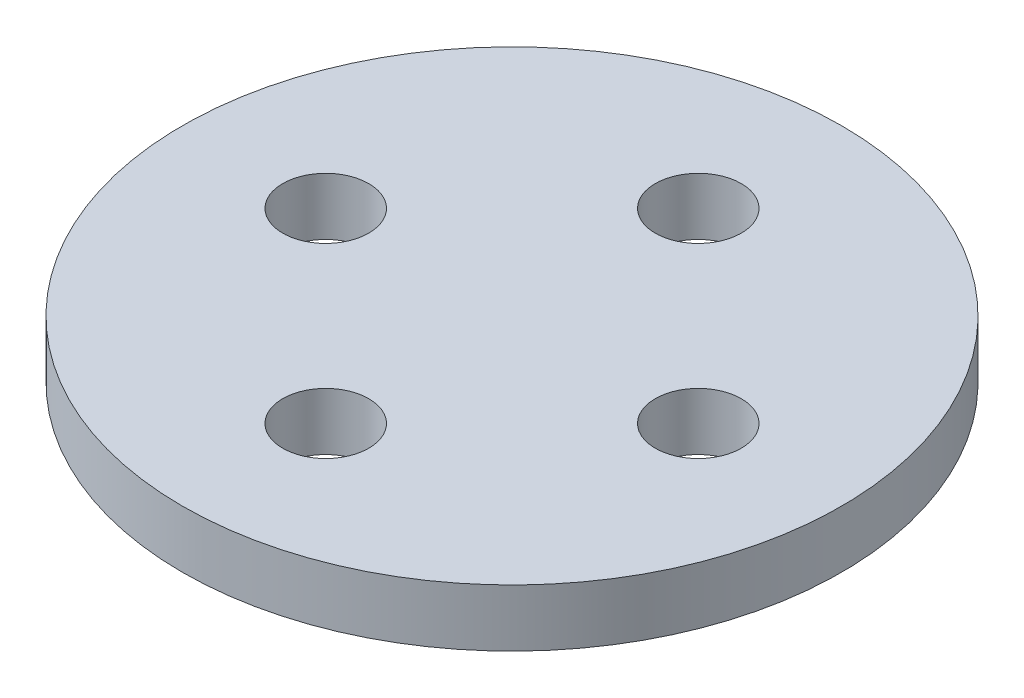
ISO-10303-21;
HEADER;
FILE_DESCRIPTION(('STEP AP214'),'2;1');
FILE_NAME('part.step','',(''),(''),'','','');
FILE_SCHEMA(('AUTOMOTIVE_DESIGN { 1 0 10303 214 1 1 1 1 }'));
ENDSEC;
DATA;
#1=APPLICATION_CONTEXT('core data for automotive mechanical design processes');
#2=APPLICATION_PROTOCOL_DEFINITION('international standard','automotive_design',2000,#1);
#3=PRODUCT_CONTEXT('',#1,'mechanical');
#4=PRODUCT('Part','Part','',(#3));
#5=PRODUCT_RELATED_PRODUCT_CATEGORY('part','',(#4));
#6=PRODUCT_DEFINITION_FORMATION('','',#4);
#7=PRODUCT_DEFINITION_CONTEXT('part definition',#1,'design');
#8=PRODUCT_DEFINITION('design','',#6,#7);
#9=PRODUCT_DEFINITION_SHAPE('','',#8);
#10=(LENGTH_UNIT() NAMED_UNIT(*) SI_UNIT(.MILLI.,.METRE.));
#11=(NAMED_UNIT(*) PLANE_ANGLE_UNIT() SI_UNIT($,.RADIAN.));
#12=(NAMED_UNIT(*) SI_UNIT($,.STERADIAN.) SOLID_ANGLE_UNIT());
#13=UNCERTAINTY_MEASURE_WITH_UNIT(LENGTH_MEASURE(1.E-05),#10,'distance_accuracy_value','');
#14=(GEOMETRIC_REPRESENTATION_CONTEXT(3) GLOBAL_UNCERTAINTY_ASSIGNED_CONTEXT((#13)) GLOBAL_UNIT_ASSIGNED_CONTEXT((#10,
#11,#12)) REPRESENTATION_CONTEXT('',''));
#15=CARTESIAN_POINT('',(0.,0.,0.));
#16=DIRECTION('',(0.,0.,1.));
#17=DIRECTION('',(1.,0.,0.));
#18=AXIS2_PLACEMENT_3D('',#15,#16,#17);
#19=CARTESIAN_POINT('',(0.,2.,0.));
#20=DIRECTION('',(0.,-1.,0.));
#21=DIRECTION('',(0.,0.,-1.));
#22=AXIS2_PLACEMENT_3D('',#19,#20,#21);
#23=CYLINDRICAL_SURFACE('',#22,11.5);
#24=CARTESIAN_POINT('',(0.,2.,0.));
#25=DIRECTION('',(0.,1.,0.));
#26=DIRECTION('',(0.,0.,1.));
#27=AXIS2_PLACEMENT_3D('',#24,#25,#26);
#28=CIRCLE('',#27,11.5);
#29=CARTESIAN_POINT('',(0.,2.,11.5));
#30=VERTEX_POINT('',#29);
#31=EDGE_CURVE('E10',#30,#30,#28,.T.);
#32=ORIENTED_EDGE('',*,*,#31,.F.);
#33=EDGE_LOOP('',(#32));
#34=FACE_BOUND('',#33,.T.);
#35=CARTESIAN_POINT('',(0.,0.,0.));
#36=DIRECTION('',(0.,1.,0.));
#37=DIRECTION('',(0.,0.,1.));
#38=AXIS2_PLACEMENT_3D('',#35,#36,#37);
#39=CIRCLE('',#38,11.5);
#40=CARTESIAN_POINT('',(0.,0.,11.5));
#41=VERTEX_POINT('',#40);
#42=EDGE_CURVE('E42',#41,#41,#39,.T.);
#43=ORIENTED_EDGE('',*,*,#42,.T.);
#44=EDGE_LOOP('',(#43));
#45=FACE_BOUND('',#44,.T.);
#46=ADVANCED_FACE('F39',(#34,#45),#23,.T.);
#47=CARTESIAN_POINT('',(0.,2.,0.));
#48=DIRECTION('',(0.,1.,0.));
#49=DIRECTION('',(0.,0.,1.));
#50=AXIS2_PLACEMENT_3D('',#47,#48,#49);
#51=PLANE('',#50);
#52=CARTESIAN_POINT('',(6.49999999999999,2.,0.));
#53=DIRECTION('',(0.,-1.,0.));
#54=DIRECTION('',(0.,0.,-1.));
#55=AXIS2_PLACEMENT_3D('',#52,#53,#54);
#56=CIRCLE('',#55,1.5);
#57=CARTESIAN_POINT('',(6.49999999999999,2.,-1.5));
#58=VERTEX_POINT('',#57);
#59=EDGE_CURVE('E52',#58,#58,#56,.T.);
#60=ORIENTED_EDGE('',*,*,#59,.T.);
#61=EDGE_LOOP('',(#60));
#62=FACE_BOUND('',#61,.T.);
#63=CARTESIAN_POINT('',(0.,2.,-6.5));
#64=DIRECTION('',(0.,-1.,0.));
#65=DIRECTION('',(0.,0.,-1.));
#66=AXIS2_PLACEMENT_3D('',#63,#64,#65);
#67=CIRCLE('',#66,1.5);
#68=CARTESIAN_POINT('',(0.,2.,-8.00000000000001));
#69=VERTEX_POINT('',#68);
#70=EDGE_CURVE('E66',#69,#69,#67,.T.);
#71=ORIENTED_EDGE('',*,*,#70,.T.);
#72=EDGE_LOOP('',(#71));
#73=FACE_BOUND('',#72,.T.);
#74=CARTESIAN_POINT('',(-6.50000000000001,2.,0.));
#75=DIRECTION('',(0.,-1.,0.));
#76=DIRECTION('',(0.,0.,-1.));
#77=AXIS2_PLACEMENT_3D('',#74,#75,#76);
#78=CIRCLE('',#77,1.50000000000001);
#79=CARTESIAN_POINT('',(-6.50000000000001,2.,-1.50000000000001));
#80=VERTEX_POINT('',#79);
#81=EDGE_CURVE('E60',#80,#80,#78,.T.);
#82=ORIENTED_EDGE('',*,*,#81,.T.);
#83=EDGE_LOOP('',(#82));
#84=FACE_BOUND('',#83,.T.);
#85=CARTESIAN_POINT('',(0.,2.,6.5));
#86=DIRECTION('',(0.,-1.,0.));
#87=DIRECTION('',(0.,0.,-1.));
#88=AXIS2_PLACEMENT_3D('',#85,#86,#87);
#89=CIRCLE('',#88,1.50000000000001);
#90=CARTESIAN_POINT('',(0.,2.,5.));
#91=VERTEX_POINT('',#90);
#92=EDGE_CURVE('E54',#91,#91,#89,.T.);
#93=ORIENTED_EDGE('',*,*,#92,.T.);
#94=EDGE_LOOP('',(#93));
#95=FACE_BOUND('',#94,.T.);
#96=ORIENTED_EDGE('',*,*,#31,.T.);
#97=EDGE_LOOP('',(#96));
#98=FACE_BOUND('',#97,.T.);
#99=ADVANCED_FACE('F80',(#62,#73,#84,#95,#98),#51,.T.);
#100=CARTESIAN_POINT('',(0.,0.,0.));
#101=DIRECTION('',(0.,1.,0.));
#102=DIRECTION('',(0.,0.,1.));
#103=AXIS2_PLACEMENT_3D('',#100,#101,#102);
#104=PLANE('',#103);
#105=CARTESIAN_POINT('',(6.49999999999999,0.,0.));
#106=DIRECTION('',(0.,-1.,0.));
#107=DIRECTION('',(0.,0.,-1.));
#108=AXIS2_PLACEMENT_3D('',#105,#106,#107);
#109=CIRCLE('',#108,1.5);
#110=CARTESIAN_POINT('',(6.49999999999999,0.,-1.5));
#111=VERTEX_POINT('',#110);
#112=EDGE_CURVE('E73',#111,#111,#109,.T.);
#113=ORIENTED_EDGE('',*,*,#112,.F.);
#114=EDGE_LOOP('',(#113));
#115=FACE_BOUND('',#114,.T.);
#116=CARTESIAN_POINT('',(0.,0.,-6.5));
#117=DIRECTION('',(0.,-1.,0.));
#118=DIRECTION('',(0.,0.,-1.));
#119=AXIS2_PLACEMENT_3D('',#116,#117,#118);
#120=CIRCLE('',#119,1.5);
#121=CARTESIAN_POINT('',(0.,0.,-8.00000000000001));
#122=VERTEX_POINT('',#121);
#123=EDGE_CURVE('E70',#122,#122,#120,.T.);
#124=ORIENTED_EDGE('',*,*,#123,.F.);
#125=EDGE_LOOP('',(#124));
#126=FACE_BOUND('',#125,.T.);
#127=CARTESIAN_POINT('',(-6.50000000000001,0.,0.));
#128=DIRECTION('',(0.,-1.,0.));
#129=DIRECTION('',(0.,0.,-1.));
#130=AXIS2_PLACEMENT_3D('',#127,#128,#129);
#131=CIRCLE('',#130,1.50000000000001);
#132=CARTESIAN_POINT('',(-6.50000000000001,0.,-1.50000000000001));
#133=VERTEX_POINT('',#132);
#134=EDGE_CURVE('E63',#133,#133,#131,.T.);
#135=ORIENTED_EDGE('',*,*,#134,.F.);
#136=EDGE_LOOP('',(#135));
#137=FACE_BOUND('',#136,.T.);
#138=CARTESIAN_POINT('',(0.,0.,6.5));
#139=DIRECTION('',(0.,-1.,0.));
#140=DIRECTION('',(0.,0.,-1.));
#141=AXIS2_PLACEMENT_3D('',#138,#139,#140);
#142=CIRCLE('',#141,1.50000000000001);
#143=CARTESIAN_POINT('',(0.,0.,5.));
#144=VERTEX_POINT('',#143);
#145=EDGE_CURVE('E57',#144,#144,#142,.T.);
#146=ORIENTED_EDGE('',*,*,#145,.F.);
#147=EDGE_LOOP('',(#146));
#148=FACE_BOUND('',#147,.T.);
#149=ORIENTED_EDGE('',*,*,#42,.F.);
#150=EDGE_LOOP('',(#149));
#151=FACE_BOUND('',#150,.T.);
#152=ADVANCED_FACE('F90',(#115,#126,#137,#148,#151),#104,.F.);
#153=CARTESIAN_POINT('',(0.,2.,6.5));
#154=DIRECTION('',(0.,-1.,0.));
#155=DIRECTION('',(0.,0.,-1.));
#156=AXIS2_PLACEMENT_3D('',#153,#154,#155);
#157=CYLINDRICAL_SURFACE('',#156,1.50000000000001);
#158=ORIENTED_EDGE('',*,*,#92,.F.);
#159=EDGE_LOOP('',(#158));
#160=FACE_BOUND('',#159,.T.);
#161=ORIENTED_EDGE('',*,*,#145,.T.);
#162=EDGE_LOOP('',(#161));
#163=FACE_BOUND('',#162,.T.);
#164=ADVANCED_FACE('F93',(#160,#163),#157,.F.);
#165=CARTESIAN_POINT('',(-6.50000000000001,2.,0.));
#166=DIRECTION('',(0.,-1.,0.));
#167=DIRECTION('',(0.,0.,-1.));
#168=AXIS2_PLACEMENT_3D('',#165,#166,#167);
#169=CYLINDRICAL_SURFACE('',#168,1.50000000000001);
#170=ORIENTED_EDGE('',*,*,#81,.F.);
#171=EDGE_LOOP('',(#170));
#172=FACE_BOUND('',#171,.T.);
#173=ORIENTED_EDGE('',*,*,#134,.T.);
#174=EDGE_LOOP('',(#173));
#175=FACE_BOUND('',#174,.T.);
#176=ADVANCED_FACE('F113',(#172,#175),#169,.F.);
#177=CARTESIAN_POINT('',(0.,2.,-6.5));
#178=DIRECTION('',(0.,-1.,0.));
#179=DIRECTION('',(0.,0.,-1.));
#180=AXIS2_PLACEMENT_3D('',#177,#178,#179);
#181=CYLINDRICAL_SURFACE('',#180,1.5);
#182=ORIENTED_EDGE('',*,*,#70,.F.);
#183=EDGE_LOOP('',(#182));
#184=FACE_BOUND('',#183,.T.);
#185=ORIENTED_EDGE('',*,*,#123,.T.);
#186=EDGE_LOOP('',(#185));
#187=FACE_BOUND('',#186,.T.);
#188=ADVANCED_FACE('F86',(#184,#187),#181,.F.);
#189=CARTESIAN_POINT('',(6.49999999999999,2.,0.));
#190=DIRECTION('',(0.,-1.,0.));
#191=DIRECTION('',(0.,0.,-1.));
#192=AXIS2_PLACEMENT_3D('',#189,#190,#191);
#193=CYLINDRICAL_SURFACE('',#192,1.5);
#194=ORIENTED_EDGE('',*,*,#59,.F.);
#195=EDGE_LOOP('',(#194));
#196=FACE_BOUND('',#195,.T.);
#197=ORIENTED_EDGE('',*,*,#112,.T.);
#198=EDGE_LOOP('',(#197));
#199=FACE_BOUND('',#198,.T.);
#200=ADVANCED_FACE('F83',(#196,#199),#193,.F.);
#201=CLOSED_SHELL('',(#46,#99,#152,#164,#176,#188,#200));
#202=MANIFOLD_SOLID_BREP('B2',#201);
#203=ADVANCED_BREP_SHAPE_REPRESENTATION('',(#18,#202),#14);
#204=SHAPE_DEFINITION_REPRESENTATION(#9,#203);
ENDSEC;
END-ISO-10303-21;
